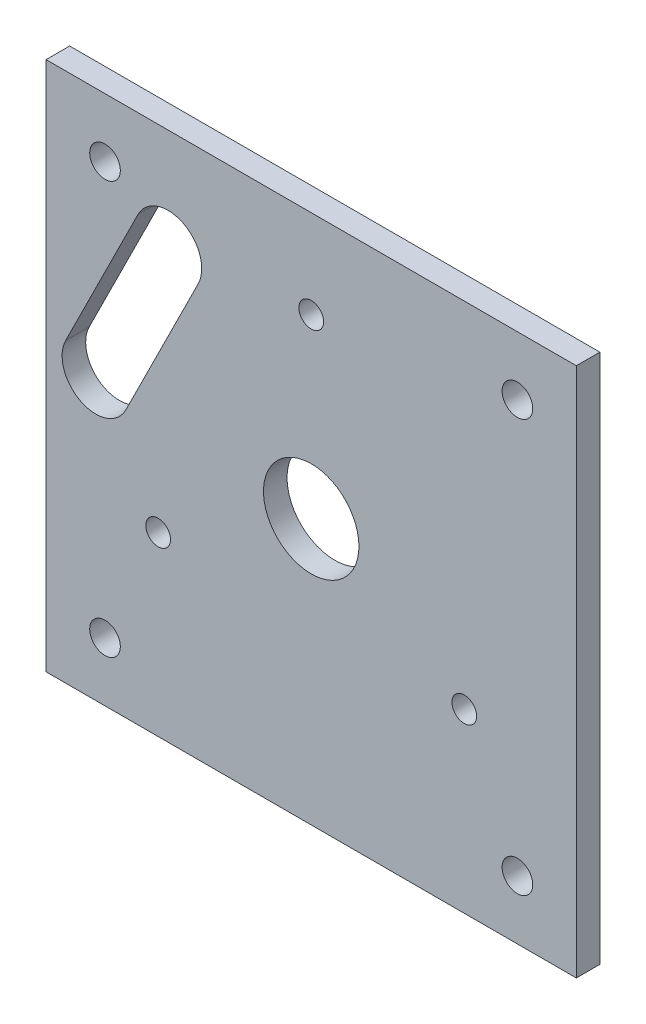
ISO-10303-21;
HEADER;
FILE_DESCRIPTION(('STEP AP214'),'2;1');
FILE_NAME('part.step','',(''),(''),'','','');
FILE_SCHEMA(('AUTOMOTIVE_DESIGN { 1 0 10303 214 1 1 1 1 }'));
ENDSEC;
DATA;
#1=APPLICATION_CONTEXT('core data for automotive mechanical design processes');
#2=APPLICATION_PROTOCOL_DEFINITION('international standard','automotive_design',2000,#1);
#3=PRODUCT_CONTEXT('',#1,'mechanical');
#4=PRODUCT('Part','Part','',(#3));
#5=PRODUCT_RELATED_PRODUCT_CATEGORY('part','',(#4));
#6=PRODUCT_DEFINITION_FORMATION('','',#4);
#7=PRODUCT_DEFINITION_CONTEXT('part definition',#1,'design');
#8=PRODUCT_DEFINITION('design','',#6,#7);
#9=PRODUCT_DEFINITION_SHAPE('','',#8);
#10=(LENGTH_UNIT() NAMED_UNIT(*) SI_UNIT(.MILLI.,.METRE.));
#11=(NAMED_UNIT(*) PLANE_ANGLE_UNIT() SI_UNIT($,.RADIAN.));
#12=(NAMED_UNIT(*) SI_UNIT($,.STERADIAN.) SOLID_ANGLE_UNIT());
#13=UNCERTAINTY_MEASURE_WITH_UNIT(LENGTH_MEASURE(1.E-05),#10,'distance_accuracy_value','');
#14=(GEOMETRIC_REPRESENTATION_CONTEXT(3) GLOBAL_UNCERTAINTY_ASSIGNED_CONTEXT((#13)) GLOBAL_UNIT_ASSIGNED_CONTEXT((#10,
#11,#12)) REPRESENTATION_CONTEXT('',''));
#15=CARTESIAN_POINT('',(0.,0.,0.));
#16=DIRECTION('',(0.,0.,1.));
#17=DIRECTION('',(1.,0.,0.));
#18=AXIS2_PLACEMENT_3D('',#15,#16,#17);
#19=CARTESIAN_POINT('',(0.,0.,0.));
#20=DIRECTION('',(0.,0.,1.));
#21=DIRECTION('',(1.,0.,0.));
#22=AXIS2_PLACEMENT_3D('',#19,#20,#21);
#23=PLANE('',#22);
#24=CARTESIAN_POINT('',(-24.296616613682,27.4848604227172,0.));
#25=DIRECTION('',(0.,0.,-1.));
#26=DIRECTION('',(-1.,0.,0.));
#27=AXIS2_PLACEMENT_3D('',#24,#25,#26);
#28=CIRCLE('',#27,5.70768579544892);
#29=CARTESIAN_POINT('',(-29.4060189874971,30.0288109965338,0.));
#30=VERTEX_POINT('',#29);
#31=CARTESIAN_POINT('',(-19.1872142398668,24.9409098489006,0.));
#32=VERTEX_POINT('',#31);
#33=EDGE_CURVE('E134',#30,#32,#28,.T.);
#34=ORIENTED_EDGE('',*,*,#33,.F.);
#35=DIRECTION('',(0.445706134672841,0.895179334834644,0.));
#36=VECTOR('',#35,1.);
#37=CARTESIAN_POINT('',(-35.545499758193,17.6979591526932,0.));
#38=LINE('',#37,#36);
#39=CARTESIAN_POINT('',(-41.6849805288889,5.3671073088527,0.));
#40=VERTEX_POINT('',#39);
#41=EDGE_CURVE('E68',#40,#30,#38,.T.);
#42=ORIENTED_EDGE('',*,*,#41,.F.);
#43=CARTESIAN_POINT('',(-36.5755781550738,2.82315673503608,0.));
#44=DIRECTION('',(0.,0.,-1.));
#45=DIRECTION('',(-1.,0.,0.));
#46=AXIS2_PLACEMENT_3D('',#43,#44,#45);
#47=CIRCLE('',#46,5.70768579544892);
#48=CARTESIAN_POINT('',(-31.4661757812587,0.27920616121946,0.));
#49=VERTEX_POINT('',#48);
#50=EDGE_CURVE('E140',#49,#40,#47,.T.);
#51=ORIENTED_EDGE('',*,*,#50,.F.);
#52=DIRECTION('',(0.445706134672841,0.895179334834644,0.));
#53=VECTOR('',#52,1.);
#54=CARTESIAN_POINT('',(-25.3266950105628,12.61005800506,0.));
#55=LINE('',#54,#53);
#56=EDGE_CURVE('E124',#49,#32,#55,.T.);
#57=ORIENTED_EDGE('',*,*,#56,.T.);
#58=EDGE_LOOP('',(#34,#42,#51,#57));
#59=FACE_BOUND('',#58,.T.);
#60=CARTESIAN_POINT('',(0.,0.,0.));
#61=DIRECTION('',(0.,0.,1.));
#62=DIRECTION('',(1.,0.,0.));
#63=AXIS2_PLACEMENT_3D('',#60,#61,#62);
#64=CIRCLE('',#63,8.1);
#65=CARTESIAN_POINT('',(8.1,0.,0.));
#66=VERTEX_POINT('',#65);
#67=EDGE_CURVE('E182',#66,#66,#64,.T.);
#68=ORIENTED_EDGE('',*,*,#67,.T.);
#69=EDGE_LOOP('',(#68));
#70=FACE_BOUND('',#69,.T.);
#71=CARTESIAN_POINT('',(35.,-35.,0.));
#72=DIRECTION('',(0.,0.,-1.));
#73=DIRECTION('',(-1.,0.,0.));
#74=AXIS2_PLACEMENT_3D('',#71,#72,#73);
#75=CIRCLE('',#74,2.6);
#76=CARTESIAN_POINT('',(32.4,-35.,0.));
#77=VERTEX_POINT('',#76);
#78=EDGE_CURVE('E187',#77,#77,#75,.T.);
#79=ORIENTED_EDGE('',*,*,#78,.F.);
#80=EDGE_LOOP('',(#79));
#81=FACE_BOUND('',#80,.T.);
#82=CARTESIAN_POINT('',(-35.,-35.,0.));
#83=DIRECTION('',(0.,0.,-1.));
#84=DIRECTION('',(-1.,0.,0.));
#85=AXIS2_PLACEMENT_3D('',#82,#83,#84);
#86=CIRCLE('',#85,2.6);
#87=CARTESIAN_POINT('',(-37.6,-35.,0.));
#88=VERTEX_POINT('',#87);
#89=EDGE_CURVE('E194',#88,#88,#86,.T.);
#90=ORIENTED_EDGE('',*,*,#89,.F.);
#91=EDGE_LOOP('',(#90));
#92=FACE_BOUND('',#91,.T.);
#93=CARTESIAN_POINT('',(-35.,35.,0.));
#94=DIRECTION('',(0.,0.,-1.));
#95=DIRECTION('',(-1.,0.,0.));
#96=AXIS2_PLACEMENT_3D('',#93,#94,#95);
#97=CIRCLE('',#96,2.6);
#98=CARTESIAN_POINT('',(-37.6,35.,0.));
#99=VERTEX_POINT('',#98);
#100=EDGE_CURVE('E190',#99,#99,#97,.T.);
#101=ORIENTED_EDGE('',*,*,#100,.F.);
#102=EDGE_LOOP('',(#101));
#103=FACE_BOUND('',#102,.T.);
#104=CARTESIAN_POINT('',(35.,35.,0.));
#105=DIRECTION('',(0.,0.,-1.));
#106=DIRECTION('',(-1.,0.,0.));
#107=AXIS2_PLACEMENT_3D('',#104,#105,#106);
#108=CIRCLE('',#107,2.6);
#109=CARTESIAN_POINT('',(32.4,35.,0.));
#110=VERTEX_POINT('',#109);
#111=EDGE_CURVE('E188',#110,#110,#108,.T.);
#112=ORIENTED_EDGE('',*,*,#111,.F.);
#113=EDGE_LOOP('',(#112));
#114=FACE_BOUND('',#113,.T.);
#115=CARTESIAN_POINT('',(-25.9807621135333,-14.9999999999998,0.));
#116=DIRECTION('',(0.,0.,1.));
#117=DIRECTION('',(1.,0.,0.));
#118=AXIS2_PLACEMENT_3D('',#115,#116,#117);
#119=CIRCLE('',#118,2.1);
#120=CARTESIAN_POINT('',(-23.8807621135333,-14.9999999999998,0.));
#121=VERTEX_POINT('',#120);
#122=EDGE_CURVE('E215',#121,#121,#119,.T.);
#123=ORIENTED_EDGE('',*,*,#122,.T.);
#124=EDGE_LOOP('',(#123));
#125=FACE_BOUND('',#124,.T.);
#126=CARTESIAN_POINT('',(0.,30.,0.));
#127=DIRECTION('',(0.,0.,1.));
#128=DIRECTION('',(1.,0.,0.));
#129=AXIS2_PLACEMENT_3D('',#126,#127,#128);
#130=CIRCLE('',#129,2.1);
#131=CARTESIAN_POINT('',(2.1,30.,0.));
#132=VERTEX_POINT('',#131);
#133=EDGE_CURVE('E224',#132,#132,#130,.T.);
#134=ORIENTED_EDGE('',*,*,#133,.T.);
#135=EDGE_LOOP('',(#134));
#136=FACE_BOUND('',#135,.T.);
#137=CARTESIAN_POINT('',(25.9807621135331,-15.0000000000001,0.));
#138=DIRECTION('',(0.,0.,1.));
#139=DIRECTION('',(1.,0.,0.));
#140=AXIS2_PLACEMENT_3D('',#137,#138,#139);
#141=CIRCLE('',#140,2.1);
#142=CARTESIAN_POINT('',(28.0807621135331,-15.0000000000001,0.));
#143=VERTEX_POINT('',#142);
#144=EDGE_CURVE('E223',#143,#143,#141,.T.);
#145=ORIENTED_EDGE('',*,*,#144,.T.);
#146=EDGE_LOOP('',(#145));
#147=FACE_BOUND('',#146,.T.);
#148=DIRECTION('',(0.,-1.,0.));
#149=VECTOR('',#148,1.);
#150=CARTESIAN_POINT('',(45.,-45.,0.));
#151=LINE('',#150,#149);
#152=CARTESIAN_POINT('',(45.,45.,0.));
#153=VERTEX_POINT('',#152);
#154=CARTESIAN_POINT('',(45.,-45.,0.));
#155=VERTEX_POINT('',#154);
#156=EDGE_CURVE('E200',#153,#155,#151,.T.);
#157=ORIENTED_EDGE('',*,*,#156,.T.);
#158=DIRECTION('',(-1.,0.,0.));
#159=VECTOR('',#158,1.);
#160=CARTESIAN_POINT('',(-45.,-45.,0.));
#161=LINE('',#160,#159);
#162=CARTESIAN_POINT('',(-45.,-45.,0.));
#163=VERTEX_POINT('',#162);
#164=EDGE_CURVE('E202',#155,#163,#161,.T.);
#165=ORIENTED_EDGE('',*,*,#164,.T.);
#166=DIRECTION('',(0.,1.,0.));
#167=VECTOR('',#166,1.);
#168=CARTESIAN_POINT('',(-45.,-45.,0.));
#169=LINE('',#168,#167);
#170=CARTESIAN_POINT('',(-45.,45.,0.));
#171=VERTEX_POINT('',#170);
#172=EDGE_CURVE('E201',#163,#171,#169,.T.);
#173=ORIENTED_EDGE('',*,*,#172,.T.);
#174=DIRECTION('',(1.,0.,0.));
#175=VECTOR('',#174,1.);
#176=CARTESIAN_POINT('',(-45.,45.,0.));
#177=LINE('',#176,#175);
#178=EDGE_CURVE('E210',#171,#153,#177,.T.);
#179=ORIENTED_EDGE('',*,*,#178,.T.);
#180=EDGE_LOOP('',(#157,#165,#173,#179));
#181=FACE_BOUND('',#180,.T.);
#182=ADVANCED_FACE('F57',(#59,#70,#81,#92,#103,#114,#125,#136,#147,#181),#23,.F.);
#183=CARTESIAN_POINT('',(0.,30.,-8.5));
#184=DIRECTION('',(0.,0.,1.));
#185=DIRECTION('',(1.,0.,0.));
#186=AXIS2_PLACEMENT_3D('',#183,#184,#185);
#187=CYLINDRICAL_SURFACE('',#186,2.1);
#188=ORIENTED_EDGE('',*,*,#133,.F.);
#189=EDGE_LOOP('',(#188));
#190=FACE_BOUND('',#189,.T.);
#191=CARTESIAN_POINT('',(0.,30.,4.));
#192=DIRECTION('',(0.,0.,1.));
#193=DIRECTION('',(1.,0.,0.));
#194=AXIS2_PLACEMENT_3D('',#191,#192,#193);
#195=CIRCLE('',#194,2.1);
#196=CARTESIAN_POINT('',(2.1,30.,4.));
#197=VERTEX_POINT('',#196);
#198=EDGE_CURVE('E162',#197,#197,#195,.T.);
#199=ORIENTED_EDGE('',*,*,#198,.T.);
#200=EDGE_LOOP('',(#199));
#201=FACE_BOUND('',#200,.T.);
#202=ADVANCED_FACE('F248',(#190,#201),#187,.F.);
#203=CARTESIAN_POINT('',(25.9807621135331,-15.0000000000001,-8.5));
#204=DIRECTION('',(0.,0.,1.));
#205=DIRECTION('',(1.,0.,0.));
#206=AXIS2_PLACEMENT_3D('',#203,#204,#205);
#207=CYLINDRICAL_SURFACE('',#206,2.1);
#208=ORIENTED_EDGE('',*,*,#144,.F.);
#209=EDGE_LOOP('',(#208));
#210=FACE_BOUND('',#209,.T.);
#211=CARTESIAN_POINT('',(25.9807621135331,-15.0000000000001,4.));
#212=DIRECTION('',(0.,0.,1.));
#213=DIRECTION('',(1.,0.,0.));
#214=AXIS2_PLACEMENT_3D('',#211,#212,#213);
#215=CIRCLE('',#214,2.1);
#216=CARTESIAN_POINT('',(28.0807621135331,-15.0000000000001,4.));
#217=VERTEX_POINT('',#216);
#218=EDGE_CURVE('E156',#217,#217,#215,.T.);
#219=ORIENTED_EDGE('',*,*,#218,.T.);
#220=EDGE_LOOP('',(#219));
#221=FACE_BOUND('',#220,.T.);
#222=ADVANCED_FACE('F251',(#210,#221),#207,.F.);
#223=CARTESIAN_POINT('',(-25.9807621135333,-14.9999999999998,-8.5));
#224=DIRECTION('',(0.,0.,1.));
#225=DIRECTION('',(1.,0.,0.));
#226=AXIS2_PLACEMENT_3D('',#223,#224,#225);
#227=CYLINDRICAL_SURFACE('',#226,2.1);
#228=ORIENTED_EDGE('',*,*,#122,.F.);
#229=EDGE_LOOP('',(#228));
#230=FACE_BOUND('',#229,.T.);
#231=CARTESIAN_POINT('',(-25.9807621135333,-14.9999999999998,4.));
#232=DIRECTION('',(0.,0.,1.));
#233=DIRECTION('',(1.,0.,0.));
#234=AXIS2_PLACEMENT_3D('',#231,#232,#233);
#235=CIRCLE('',#234,2.1);
#236=CARTESIAN_POINT('',(-23.8807621135333,-14.9999999999998,4.));
#237=VERTEX_POINT('',#236);
#238=EDGE_CURVE('E166',#237,#237,#235,.T.);
#239=ORIENTED_EDGE('',*,*,#238,.T.);
#240=EDGE_LOOP('',(#239));
#241=FACE_BOUND('',#240,.T.);
#242=ADVANCED_FACE('F257',(#230,#241),#227,.F.);
#243=CARTESIAN_POINT('',(45.,-45.,10.));
#244=DIRECTION('',(1.,0.,0.));
#245=DIRECTION('',(0.,1.,0.));
#246=AXIS2_PLACEMENT_3D('',#243,#244,#245);
#247=PLANE('',#246);
#248=DIRECTION('',(0.,0.,-1.));
#249=VECTOR('',#248,1.);
#250=CARTESIAN_POINT('',(45.,-45.,10.));
#251=LINE('',#250,#249);
#252=CARTESIAN_POINT('',(45.,-45.,4.));
#253=VERTEX_POINT('',#252);
#254=EDGE_CURVE('E208',#253,#155,#251,.T.);
#255=ORIENTED_EDGE('',*,*,#254,.T.);
#256=ORIENTED_EDGE('',*,*,#156,.F.);
#257=DIRECTION('',(0.,0.,-1.));
#258=VECTOR('',#257,1.);
#259=CARTESIAN_POINT('',(45.,45.,10.));
#260=LINE('',#259,#258);
#261=CARTESIAN_POINT('',(45.,45.,4.));
#262=VERTEX_POINT('',#261);
#263=EDGE_CURVE('E214',#262,#153,#260,.T.);
#264=ORIENTED_EDGE('',*,*,#263,.F.);
#265=DIRECTION('',(0.,1.,0.));
#266=VECTOR('',#265,1.);
#267=CARTESIAN_POINT('',(45.,-45.,4.));
#268=LINE('',#267,#266);
#269=EDGE_CURVE('E171',#253,#262,#268,.T.);
#270=ORIENTED_EDGE('',*,*,#269,.F.);
#271=EDGE_LOOP('',(#255,#256,#264,#270));
#272=FACE_BOUND('',#271,.T.);
#273=ADVANCED_FACE('F269',(#272),#247,.T.);
#274=CARTESIAN_POINT('',(-45.,45.,10.));
#275=DIRECTION('',(0.,1.,0.));
#276=DIRECTION('',(-1.,0.,0.));
#277=AXIS2_PLACEMENT_3D('',#274,#275,#276);
#278=PLANE('',#277);
#279=ORIENTED_EDGE('',*,*,#263,.T.);
#280=ORIENTED_EDGE('',*,*,#178,.F.);
#281=DIRECTION('',(0.,0.,-1.));
#282=VECTOR('',#281,1.);
#283=CARTESIAN_POINT('',(-45.,45.,10.));
#284=LINE('',#283,#282);
#285=CARTESIAN_POINT('',(-45.,45.,4.));
#286=VERTEX_POINT('',#285);
#287=EDGE_CURVE('E213',#286,#171,#284,.T.);
#288=ORIENTED_EDGE('',*,*,#287,.F.);
#289=DIRECTION('',(-1.,0.,0.));
#290=VECTOR('',#289,1.);
#291=CARTESIAN_POINT('',(-45.,45.,4.));
#292=LINE('',#291,#290);
#293=EDGE_CURVE('E172',#262,#286,#292,.T.);
#294=ORIENTED_EDGE('',*,*,#293,.F.);
#295=EDGE_LOOP('',(#279,#280,#288,#294));
#296=FACE_BOUND('',#295,.T.);
#297=ADVANCED_FACE('F275',(#296),#278,.T.);
#298=CARTESIAN_POINT('',(-45.,-45.,10.));
#299=DIRECTION('',(-1.,0.,0.));
#300=DIRECTION('',(0.,0.,1.));
#301=AXIS2_PLACEMENT_3D('',#298,#299,#300);
#302=PLANE('',#301);
#303=ORIENTED_EDGE('',*,*,#287,.T.);
#304=ORIENTED_EDGE('',*,*,#172,.F.);
#305=DIRECTION('',(0.,0.,-1.));
#306=VECTOR('',#305,1.);
#307=CARTESIAN_POINT('',(-45.,-45.,10.));
#308=LINE('',#307,#306);
#309=CARTESIAN_POINT('',(-45.,-45.,4.));
#310=VERTEX_POINT('',#309);
#311=EDGE_CURVE('E217',#310,#163,#308,.T.);
#312=ORIENTED_EDGE('',*,*,#311,.F.);
#313=DIRECTION('',(0.,-1.,0.));
#314=VECTOR('',#313,1.);
#315=CARTESIAN_POINT('',(-45.,-45.,4.));
#316=LINE('',#315,#314);
#317=EDGE_CURVE('E180',#286,#310,#316,.T.);
#318=ORIENTED_EDGE('',*,*,#317,.F.);
#319=EDGE_LOOP('',(#303,#304,#312,#318));
#320=FACE_BOUND('',#319,.T.);
#321=ADVANCED_FACE('F314',(#320),#302,.T.);
#322=CARTESIAN_POINT('',(-45.,-45.,10.));
#323=DIRECTION('',(0.,-1.,0.));
#324=DIRECTION('',(1.,0.,0.));
#325=AXIS2_PLACEMENT_3D('',#322,#323,#324);
#326=PLANE('',#325);
#327=ORIENTED_EDGE('',*,*,#311,.T.);
#328=ORIENTED_EDGE('',*,*,#164,.F.);
#329=ORIENTED_EDGE('',*,*,#254,.F.);
#330=DIRECTION('',(1.,0.,0.));
#331=VECTOR('',#330,1.);
#332=CARTESIAN_POINT('',(-45.,-45.,4.));
#333=LINE('',#332,#331);
#334=EDGE_CURVE('E179',#310,#253,#333,.T.);
#335=ORIENTED_EDGE('',*,*,#334,.F.);
#336=EDGE_LOOP('',(#327,#328,#329,#335));
#337=FACE_BOUND('',#336,.T.);
#338=ADVANCED_FACE('F311',(#337),#326,.T.);
#339=CARTESIAN_POINT('',(35.,35.,10.));
#340=DIRECTION('',(0.,0.,-1.));
#341=DIRECTION('',(-1.,0.,0.));
#342=AXIS2_PLACEMENT_3D('',#339,#340,#341);
#343=CYLINDRICAL_SURFACE('',#342,2.6);
#344=ORIENTED_EDGE('',*,*,#111,.T.);
#345=EDGE_LOOP('',(#344));
#346=FACE_BOUND('',#345,.T.);
#347=CARTESIAN_POINT('',(35.,35.,4.));
#348=DIRECTION('',(0.,0.,1.));
#349=DIRECTION('',(1.,0.,0.));
#350=AXIS2_PLACEMENT_3D('',#347,#348,#349);
#351=CIRCLE('',#350,2.6);
#352=CARTESIAN_POINT('',(37.6,35.,4.));
#353=VERTEX_POINT('',#352);
#354=EDGE_CURVE('E155',#353,#353,#351,.T.);
#355=ORIENTED_EDGE('',*,*,#354,.T.);
#356=EDGE_LOOP('',(#355));
#357=FACE_BOUND('',#356,.T.);
#358=ADVANCED_FACE('F308',(#346,#357),#343,.F.);
#359=CARTESIAN_POINT('',(-35.,35.,10.));
#360=DIRECTION('',(0.,0.,-1.));
#361=DIRECTION('',(-1.,0.,0.));
#362=AXIS2_PLACEMENT_3D('',#359,#360,#361);
#363=CYLINDRICAL_SURFACE('',#362,2.6);
#364=ORIENTED_EDGE('',*,*,#100,.T.);
#365=EDGE_LOOP('',(#364));
#366=FACE_BOUND('',#365,.T.);
#367=CARTESIAN_POINT('',(-35.,35.,4.));
#368=DIRECTION('',(0.,0.,1.));
#369=DIRECTION('',(1.,0.,0.));
#370=AXIS2_PLACEMENT_3D('',#367,#368,#369);
#371=CIRCLE('',#370,2.6);
#372=CARTESIAN_POINT('',(-32.4,35.,4.));
#373=VERTEX_POINT('',#372);
#374=EDGE_CURVE('E157',#373,#373,#371,.T.);
#375=ORIENTED_EDGE('',*,*,#374,.T.);
#376=EDGE_LOOP('',(#375));
#377=FACE_BOUND('',#376,.T.);
#378=ADVANCED_FACE('F303',(#366,#377),#363,.F.);
#379=CARTESIAN_POINT('',(-35.,-35.,10.));
#380=DIRECTION('',(0.,0.,-1.));
#381=DIRECTION('',(-1.,0.,0.));
#382=AXIS2_PLACEMENT_3D('',#379,#380,#381);
#383=CYLINDRICAL_SURFACE('',#382,2.6);
#384=ORIENTED_EDGE('',*,*,#89,.T.);
#385=EDGE_LOOP('',(#384));
#386=FACE_BOUND('',#385,.T.);
#387=CARTESIAN_POINT('',(-35.,-35.,4.));
#388=DIRECTION('',(0.,0.,1.));
#389=DIRECTION('',(1.,0.,0.));
#390=AXIS2_PLACEMENT_3D('',#387,#388,#389);
#391=CIRCLE('',#390,2.6);
#392=CARTESIAN_POINT('',(-32.4,-35.,4.));
#393=VERTEX_POINT('',#392);
#394=EDGE_CURVE('E147',#393,#393,#391,.T.);
#395=ORIENTED_EDGE('',*,*,#394,.T.);
#396=EDGE_LOOP('',(#395));
#397=FACE_BOUND('',#396,.T.);
#398=ADVANCED_FACE('F294',(#386,#397),#383,.F.);
#399=CARTESIAN_POINT('',(35.,-35.,10.));
#400=DIRECTION('',(0.,0.,-1.));
#401=DIRECTION('',(-1.,0.,0.));
#402=AXIS2_PLACEMENT_3D('',#399,#400,#401);
#403=CYLINDRICAL_SURFACE('',#402,2.6);
#404=ORIENTED_EDGE('',*,*,#78,.T.);
#405=EDGE_LOOP('',(#404));
#406=FACE_BOUND('',#405,.T.);
#407=CARTESIAN_POINT('',(35.,-35.,4.));
#408=DIRECTION('',(0.,0.,1.));
#409=DIRECTION('',(1.,0.,0.));
#410=AXIS2_PLACEMENT_3D('',#407,#408,#409);
#411=CIRCLE('',#410,2.6);
#412=CARTESIAN_POINT('',(37.6,-35.,4.));
#413=VERTEX_POINT('',#412);
#414=EDGE_CURVE('E143',#413,#413,#411,.T.);
#415=ORIENTED_EDGE('',*,*,#414,.T.);
#416=EDGE_LOOP('',(#415));
#417=FACE_BOUND('',#416,.T.);
#418=ADVANCED_FACE('F291',(#406,#417),#403,.F.);
#419=CARTESIAN_POINT('',(0.,0.,-9.));
#420=DIRECTION('',(0.,0.,1.));
#421=DIRECTION('',(1.,0.,0.));
#422=AXIS2_PLACEMENT_3D('',#419,#420,#421);
#423=CYLINDRICAL_SURFACE('',#422,8.1);
#424=ORIENTED_EDGE('',*,*,#67,.F.);
#425=EDGE_LOOP('',(#424));
#426=FACE_BOUND('',#425,.T.);
#427=CARTESIAN_POINT('',(0.,0.,4.));
#428=DIRECTION('',(0.,0.,1.));
#429=DIRECTION('',(1.,0.,0.));
#430=AXIS2_PLACEMENT_3D('',#427,#428,#429);
#431=CIRCLE('',#430,8.1);
#432=CARTESIAN_POINT('',(8.1,0.,4.));
#433=VERTEX_POINT('',#432);
#434=EDGE_CURVE('E164',#433,#433,#431,.T.);
#435=ORIENTED_EDGE('',*,*,#434,.T.);
#436=EDGE_LOOP('',(#435));
#437=FACE_BOUND('',#436,.T.);
#438=ADVANCED_FACE('F244',(#426,#437),#423,.F.);
#439=CARTESIAN_POINT('',(0.,0.,4.));
#440=DIRECTION('',(0.,0.,-1.));
#441=DIRECTION('',(-1.,0.,0.));
#442=AXIS2_PLACEMENT_3D('',#439,#440,#441);
#443=PLANE('',#442);
#444=CARTESIAN_POINT('',(-36.5755781550738,2.82315673503608,4.));
#445=DIRECTION('',(0.,0.,-1.));
#446=DIRECTION('',(-1.,0.,0.));
#447=AXIS2_PLACEMENT_3D('',#444,#445,#446);
#448=CIRCLE('',#447,5.70768579544892);
#449=CARTESIAN_POINT('',(-31.4661757812587,0.27920616121946,4.));
#450=VERTEX_POINT('',#449);
#451=CARTESIAN_POINT('',(-41.6849805288889,5.3671073088527,4.));
#452=VERTEX_POINT('',#451);
#453=EDGE_CURVE('E65',#450,#452,#448,.T.);
#454=ORIENTED_EDGE('',*,*,#453,.T.);
#455=DIRECTION('',(0.445706134672841,0.895179334834644,0.));
#456=VECTOR('',#455,1.);
#457=CARTESIAN_POINT('',(-35.545499758193,17.6979591526932,4.));
#458=LINE('',#457,#456);
#459=CARTESIAN_POINT('',(-29.4060189874971,30.0288109965338,4.));
#460=VERTEX_POINT('',#459);
#461=EDGE_CURVE('E12',#452,#460,#458,.T.);
#462=ORIENTED_EDGE('',*,*,#461,.T.);
#463=CARTESIAN_POINT('',(-24.296616613682,27.4848604227172,4.));
#464=DIRECTION('',(0.,0.,-1.));
#465=DIRECTION('',(-1.,0.,0.));
#466=AXIS2_PLACEMENT_3D('',#463,#464,#465);
#467=CIRCLE('',#466,5.70768579544892);
#468=CARTESIAN_POINT('',(-19.1872142398669,24.9409098489006,4.));
#469=VERTEX_POINT('',#468);
#470=EDGE_CURVE('E226',#460,#469,#467,.T.);
#471=ORIENTED_EDGE('',*,*,#470,.T.);
#472=DIRECTION('',(0.445706134672841,0.895179334834644,0.));
#473=VECTOR('',#472,1.);
#474=CARTESIAN_POINT('',(-25.3266950105628,12.61005800506,4.));
#475=LINE('',#474,#473);
#476=EDGE_CURVE('E129',#450,#469,#475,.T.);
#477=ORIENTED_EDGE('',*,*,#476,.F.);
#478=EDGE_LOOP('',(#454,#462,#471,#477));
#479=FACE_BOUND('',#478,.T.);
#480=ORIENTED_EDGE('',*,*,#269,.T.);
#481=ORIENTED_EDGE('',*,*,#293,.T.);
#482=ORIENTED_EDGE('',*,*,#317,.T.);
#483=ORIENTED_EDGE('',*,*,#334,.T.);
#484=EDGE_LOOP('',(#480,#481,#482,#483));
#485=FACE_BOUND('',#484,.T.);
#486=ORIENTED_EDGE('',*,*,#238,.F.);
#487=EDGE_LOOP('',(#486));
#488=FACE_BOUND('',#487,.T.);
#489=ORIENTED_EDGE('',*,*,#434,.F.);
#490=EDGE_LOOP('',(#489));
#491=FACE_BOUND('',#490,.T.);
#492=ORIENTED_EDGE('',*,*,#198,.F.);
#493=EDGE_LOOP('',(#492));
#494=FACE_BOUND('',#493,.T.);
#495=ORIENTED_EDGE('',*,*,#218,.F.);
#496=EDGE_LOOP('',(#495));
#497=FACE_BOUND('',#496,.T.);
#498=ORIENTED_EDGE('',*,*,#374,.F.);
#499=EDGE_LOOP('',(#498));
#500=FACE_BOUND('',#499,.T.);
#501=ORIENTED_EDGE('',*,*,#354,.F.);
#502=EDGE_LOOP('',(#501));
#503=FACE_BOUND('',#502,.T.);
#504=ORIENTED_EDGE('',*,*,#394,.F.);
#505=EDGE_LOOP('',(#504));
#506=FACE_BOUND('',#505,.T.);
#507=ORIENTED_EDGE('',*,*,#414,.F.);
#508=EDGE_LOOP('',(#507));
#509=FACE_BOUND('',#508,.T.);
#510=ADVANCED_FACE('F235',(#479,#485,#488,#491,#494,#497,#500,#503,#506,#509),#443,.F.);
#511=CARTESIAN_POINT('',(-35.545499758193,17.6979591526932,10.));
#512=DIRECTION('',(-0.895179334834644,0.445706134672841,0.));
#513=DIRECTION('',(-0.445706134672841,-0.895179334834644,0.));
#514=AXIS2_PLACEMENT_3D('',#511,#512,#513);
#515=PLANE('',#514);
#516=DIRECTION('',(0.,0.,-1.));
#517=VECTOR('',#516,1.);
#518=CARTESIAN_POINT('',(-41.6849805288889,5.3671073088527,10.));
#519=LINE('',#518,#517);
#520=EDGE_CURVE('E141',#452,#40,#519,.T.);
#521=ORIENTED_EDGE('',*,*,#520,.T.);
#522=ORIENTED_EDGE('',*,*,#41,.T.);
#523=DIRECTION('',(0.,0.,-1.));
#524=VECTOR('',#523,1.);
#525=CARTESIAN_POINT('',(-29.4060189874971,30.0288109965338,10.));
#526=LINE('',#525,#524);
#527=EDGE_CURVE('E128',#460,#30,#526,.T.);
#528=ORIENTED_EDGE('',*,*,#527,.F.);
#529=ORIENTED_EDGE('',*,*,#461,.F.);
#530=EDGE_LOOP('',(#521,#522,#528,#529));
#531=FACE_BOUND('',#530,.T.);
#532=ADVANCED_FACE('F240',(#531),#515,.F.);
#533=CARTESIAN_POINT('',(-36.5755781550738,2.82315673503608,10.));
#534=DIRECTION('',(0.,0.,-1.));
#535=DIRECTION('',(-1.,0.,0.));
#536=AXIS2_PLACEMENT_3D('',#533,#534,#535);
#537=CYLINDRICAL_SURFACE('',#536,5.70768579544892);
#538=DIRECTION('',(0.,0.,-1.));
#539=VECTOR('',#538,1.);
#540=CARTESIAN_POINT('',(-31.4661757812587,0.27920616121946,10.));
#541=LINE('',#540,#539);
#542=EDGE_CURVE('E130',#450,#49,#541,.T.);
#543=ORIENTED_EDGE('',*,*,#542,.T.);
#544=ORIENTED_EDGE('',*,*,#50,.T.);
#545=ORIENTED_EDGE('',*,*,#520,.F.);
#546=ORIENTED_EDGE('',*,*,#453,.F.);
#547=EDGE_LOOP('',(#543,#544,#545,#546));
#548=FACE_BOUND('',#547,.T.);
#549=ADVANCED_FACE('F236',(#548),#537,.F.);
#550=CARTESIAN_POINT('',(-25.3266950105628,12.61005800506,10.));
#551=DIRECTION('',(-0.895179334834644,0.445706134672841,0.));
#552=DIRECTION('',(-0.445706134672841,-0.895179334834644,0.));
#553=AXIS2_PLACEMENT_3D('',#550,#551,#552);
#554=PLANE('',#553);
#555=ORIENTED_EDGE('',*,*,#476,.T.);
#556=DIRECTION('',(0.,0.,-1.));
#557=VECTOR('',#556,1.);
#558=CARTESIAN_POINT('',(-19.1872142398668,24.9409098489006,10.));
#559=LINE('',#558,#557);
#560=EDGE_CURVE('E76',#469,#32,#559,.T.);
#561=ORIENTED_EDGE('',*,*,#560,.T.);
#562=ORIENTED_EDGE('',*,*,#56,.F.);
#563=ORIENTED_EDGE('',*,*,#542,.F.);
#564=EDGE_LOOP('',(#555,#561,#562,#563));
#565=FACE_BOUND('',#564,.T.);
#566=ADVANCED_FACE('F119',(#565),#554,.T.);
#567=CARTESIAN_POINT('',(-24.296616613682,27.4848604227172,10.));
#568=DIRECTION('',(0.,0.,-1.));
#569=DIRECTION('',(-1.,0.,0.));
#570=AXIS2_PLACEMENT_3D('',#567,#568,#569);
#571=CYLINDRICAL_SURFACE('',#570,5.70768579544892);
#572=ORIENTED_EDGE('',*,*,#527,.T.);
#573=ORIENTED_EDGE('',*,*,#33,.T.);
#574=ORIENTED_EDGE('',*,*,#560,.F.);
#575=ORIENTED_EDGE('',*,*,#470,.F.);
#576=EDGE_LOOP('',(#572,#573,#574,#575));
#577=FACE_BOUND('',#576,.T.);
#578=ADVANCED_FACE('F135',(#577),#571,.F.);
#579=CLOSED_SHELL('',(#182,#202,#222,#242,#273,#297,#321,#338,#358,#378,#398,#418,#438,#510,
#532,#549,#566,#578));
#580=MANIFOLD_SOLID_BREP('B2',#579);
#581=ADVANCED_BREP_SHAPE_REPRESENTATION('',(#18,#580),#14);
#582=SHAPE_DEFINITION_REPRESENTATION(#9,#581);
ENDSEC;
END-ISO-10303-21;
